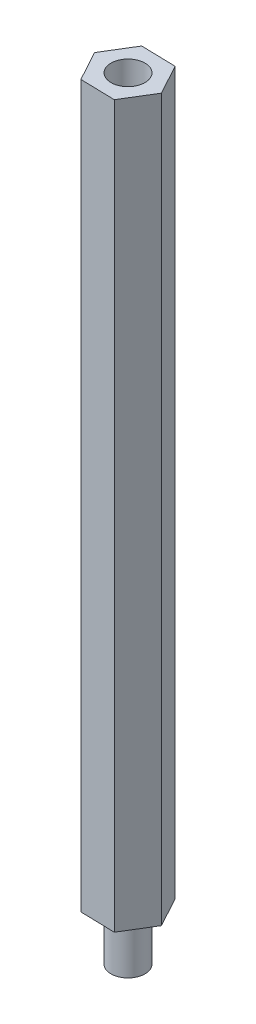
ISO-10303-21;
HEADER;
FILE_DESCRIPTION(('STEP AP214'),'2;1');
FILE_NAME('part.step','',(''),(''),'','','');
FILE_SCHEMA(('AUTOMOTIVE_DESIGN { 1 0 10303 214 1 1 1 1 }'));
ENDSEC;
DATA;
#1=APPLICATION_CONTEXT('core data for automotive mechanical design processes');
#2=APPLICATION_PROTOCOL_DEFINITION('international standard','automotive_design',2000,#1);
#3=PRODUCT_CONTEXT('',#1,'mechanical');
#4=PRODUCT('Part','Part','',(#3));
#5=PRODUCT_RELATED_PRODUCT_CATEGORY('part','',(#4));
#6=PRODUCT_DEFINITION_FORMATION('','',#4);
#7=PRODUCT_DEFINITION_CONTEXT('part definition',#1,'design');
#8=PRODUCT_DEFINITION('design','',#6,#7);
#9=PRODUCT_DEFINITION_SHAPE('','',#8);
#10=(LENGTH_UNIT() NAMED_UNIT(*) SI_UNIT(.MILLI.,.METRE.));
#11=(NAMED_UNIT(*) PLANE_ANGLE_UNIT() SI_UNIT($,.RADIAN.));
#12=(NAMED_UNIT(*) SI_UNIT($,.STERADIAN.) SOLID_ANGLE_UNIT());
#13=UNCERTAINTY_MEASURE_WITH_UNIT(LENGTH_MEASURE(1.E-05),#10,'distance_accuracy_value','');
#14=(GEOMETRIC_REPRESENTATION_CONTEXT(3) GLOBAL_UNCERTAINTY_ASSIGNED_CONTEXT((#13)) GLOBAL_UNIT_ASSIGNED_CONTEXT((#10,
#11,#12)) REPRESENTATION_CONTEXT('',''));
#15=CARTESIAN_POINT('',(0.,0.,0.));
#16=DIRECTION('',(0.,0.,1.));
#17=DIRECTION('',(1.,0.,0.));
#18=AXIS2_PLACEMENT_3D('',#15,#16,#17);
#19=CARTESIAN_POINT('',(-2.10856113065434,85.,3.44779687505327));
#20=DIRECTION('',(0.0252802878709677,0.,-0.999680402451284));
#21=DIRECTION('',(-0.999680402451284,0.,-0.0252802878709678));
#22=AXIS2_PLACEMENT_3D('',#19,#20,#21);
#23=PLANE('',#22);
#24=DIRECTION('',(0.999680402451284,0.,0.0252802878709678));
#25=VECTOR('',#24,1.);
#26=CARTESIAN_POINT('',(-2.10856113065434,0.,3.44779687505327));
#27=LINE('',#26,#25);
#28=CARTESIAN_POINT('',(-2.10856113065434,0.,3.44779687505327));
#29=VERTEX_POINT('',#28);
#30=CARTESIAN_POINT('',(1.93159911555756,0.,3.54996594210573));
#31=VERTEX_POINT('',#30);
#32=EDGE_CURVE('E136',#29,#31,#27,.T.);
#33=ORIENTED_EDGE('',*,*,#32,.T.);
#34=DIRECTION('',(0.,-1.,0.));
#35=VECTOR('',#34,1.);
#36=CARTESIAN_POINT('',(1.93159911555756,85.,3.54996594210573));
#37=LINE('',#36,#35);
#38=CARTESIAN_POINT('',(1.93159911555756,85.,3.54996594210573));
#39=VERTEX_POINT('',#38);
#40=EDGE_CURVE('E48',#39,#31,#37,.T.);
#41=ORIENTED_EDGE('',*,*,#40,.F.);
#42=DIRECTION('',(0.999680402451284,0.,0.0252802878709678));
#43=VECTOR('',#42,1.);
#44=CARTESIAN_POINT('',(-2.10856113065434,85.,3.44779687505327));
#45=LINE('',#44,#43);
#46=CARTESIAN_POINT('',(-2.10856113065434,85.,3.44779687505327));
#47=VERTEX_POINT('',#46);
#48=EDGE_CURVE('E153',#47,#39,#45,.T.);
#49=ORIENTED_EDGE('',*,*,#48,.F.);
#50=DIRECTION('',(0.,-1.,0.));
#51=VECTOR('',#50,1.);
#52=CARTESIAN_POINT('',(-2.10856113065434,85.,3.44779687505327));
#53=LINE('',#52,#51);
#54=EDGE_CURVE('E132',#47,#29,#53,.T.);
#55=ORIENTED_EDGE('',*,*,#54,.T.);
#56=EDGE_LOOP('',(#33,#41,#49,#55));
#57=FACE_BOUND('',#56,.T.);
#58=ADVANCED_FACE('F45',(#57),#23,.F.);
#59=CARTESIAN_POINT('',(1.93159911555756,85.,3.54996594210573));
#60=DIRECTION('',(-0.853108480252779,0.,-0.521733572736884));
#61=DIRECTION('',(-0.521733572736884,0.,0.85310848025278));
#62=AXIS2_PLACEMENT_3D('',#59,#60,#61);
#63=PLANE('',#62);
#64=DIRECTION('',(0.521733572736883,0.,-0.853108480252779));
#65=VECTOR('',#64,1.);
#66=CARTESIAN_POINT('',(1.93159911555756,0.,3.54996594210573));
#67=LINE('',#66,#65);
#68=CARTESIAN_POINT('',(4.0401602462119,0.,0.102169067052459));
#69=VERTEX_POINT('',#68);
#70=EDGE_CURVE('E140',#31,#69,#67,.T.);
#71=ORIENTED_EDGE('',*,*,#70,.T.);
#72=DIRECTION('',(0.,-1.,0.));
#73=VECTOR('',#72,1.);
#74=CARTESIAN_POINT('',(4.0401602462119,85.,0.102169067052459));
#75=LINE('',#74,#73);
#76=CARTESIAN_POINT('',(4.0401602462119,85.,0.102169067052459));
#77=VERTEX_POINT('',#76);
#78=EDGE_CURVE('E159',#77,#69,#75,.T.);
#79=ORIENTED_EDGE('',*,*,#78,.F.);
#80=DIRECTION('',(0.521733572736883,0.,-0.853108480252779));
#81=VECTOR('',#80,1.);
#82=CARTESIAN_POINT('',(1.93159911555756,85.,3.54996594210573));
#83=LINE('',#82,#81);
#84=EDGE_CURVE('E101',#39,#77,#83,.T.);
#85=ORIENTED_EDGE('',*,*,#84,.F.);
#86=ORIENTED_EDGE('',*,*,#40,.T.);
#87=EDGE_LOOP('',(#71,#79,#85,#86));
#88=FACE_BOUND('',#87,.T.);
#89=ADVANCED_FACE('F166',(#88),#63,.F.);
#90=CARTESIAN_POINT('',(4.0401602462119,85.,0.102169067052459));
#91=DIRECTION('',(-0.878388768123747,0.,0.477946829714401));
#92=DIRECTION('',(0.477946829714401,0.,0.878388768123747));
#93=AXIS2_PLACEMENT_3D('',#90,#91,#92);
#94=PLANE('',#93);
#95=DIRECTION('',(-0.4779468297144,0.,-0.878388768123747));
#96=VECTOR('',#95,1.);
#97=CARTESIAN_POINT('',(4.0401602462119,0.,0.102169067052459));
#98=LINE('',#97,#96);
#99=CARTESIAN_POINT('',(2.10856113065434,0.,-3.44779687505327));
#100=VERTEX_POINT('',#99);
#101=EDGE_CURVE('E144',#69,#100,#98,.T.);
#102=ORIENTED_EDGE('',*,*,#101,.T.);
#103=DIRECTION('',(0.,-1.,0.));
#104=VECTOR('',#103,1.);
#105=CARTESIAN_POINT('',(2.10856113065434,85.,-3.44779687505327));
#106=LINE('',#105,#104);
#107=CARTESIAN_POINT('',(2.10856113065434,85.,-3.44779687505327));
#108=VERTEX_POINT('',#107);
#109=EDGE_CURVE('E125',#108,#100,#106,.T.);
#110=ORIENTED_EDGE('',*,*,#109,.F.);
#111=DIRECTION('',(-0.4779468297144,0.,-0.878388768123747));
#112=VECTOR('',#111,1.);
#113=CARTESIAN_POINT('',(4.0401602462119,85.,0.102169067052459));
#114=LINE('',#113,#112);
#115=EDGE_CURVE('E114',#77,#108,#114,.T.);
#116=ORIENTED_EDGE('',*,*,#115,.F.);
#117=ORIENTED_EDGE('',*,*,#78,.T.);
#118=EDGE_LOOP('',(#102,#110,#116,#117));
#119=FACE_BOUND('',#118,.T.);
#120=ADVANCED_FACE('F172',(#119),#94,.F.);
#121=CARTESIAN_POINT('',(2.10856113065434,85.,-3.44779687505327));
#122=DIRECTION('',(-0.0252802878709678,0.,0.999680402451284));
#123=DIRECTION('',(0.999680402451284,0.,0.0252802878709678));
#124=AXIS2_PLACEMENT_3D('',#121,#122,#123);
#125=PLANE('',#124);
#126=DIRECTION('',(-0.999680402451284,0.,-0.0252802878709678));
#127=VECTOR('',#126,1.);
#128=CARTESIAN_POINT('',(2.10856113065434,0.,-3.44779687505327));
#129=LINE('',#128,#127);
#130=CARTESIAN_POINT('',(-1.93159911555756,0.,-3.54996594210573));
#131=VERTEX_POINT('',#130);
#132=EDGE_CURVE('E123',#100,#131,#129,.T.);
#133=ORIENTED_EDGE('',*,*,#132,.T.);
#134=DIRECTION('',(0.,-1.,0.));
#135=VECTOR('',#134,1.);
#136=CARTESIAN_POINT('',(-1.93159911555756,85.,-3.54996594210573));
#137=LINE('',#136,#135);
#138=CARTESIAN_POINT('',(-1.93159911555756,85.,-3.54996594210573));
#139=VERTEX_POINT('',#138);
#140=EDGE_CURVE('E120',#139,#131,#137,.T.);
#141=ORIENTED_EDGE('',*,*,#140,.F.);
#142=DIRECTION('',(-0.999680402451284,0.,-0.0252802878709678));
#143=VECTOR('',#142,1.);
#144=CARTESIAN_POINT('',(2.10856113065434,85.,-3.44779687505327));
#145=LINE('',#144,#143);
#146=EDGE_CURVE('E108',#108,#139,#145,.T.);
#147=ORIENTED_EDGE('',*,*,#146,.F.);
#148=ORIENTED_EDGE('',*,*,#109,.T.);
#149=EDGE_LOOP('',(#133,#141,#147,#148));
#150=FACE_BOUND('',#149,.T.);
#151=ADVANCED_FACE('F121',(#150),#125,.F.);
#152=CARTESIAN_POINT('',(-1.93159911555756,85.,-3.54996594210573));
#153=DIRECTION('',(0.853108480252779,0.,0.521733572736884));
#154=DIRECTION('',(0.521733572736884,0.,-0.853108480252779));
#155=AXIS2_PLACEMENT_3D('',#152,#153,#154);
#156=PLANE('',#155);
#157=DIRECTION('',(-0.521733572736884,0.,0.853108480252779));
#158=VECTOR('',#157,1.);
#159=CARTESIAN_POINT('',(-1.93159911555756,0.,-3.54996594210573));
#160=LINE('',#159,#158);
#161=CARTESIAN_POINT('',(-4.0401602462119,0.,-0.10216906705246));
#162=VERTEX_POINT('',#161);
#163=EDGE_CURVE('E86',#131,#162,#160,.T.);
#164=ORIENTED_EDGE('',*,*,#163,.T.);
#165=DIRECTION('',(0.,-1.,0.));
#166=VECTOR('',#165,1.);
#167=CARTESIAN_POINT('',(-4.0401602462119,85.,-0.10216906705246));
#168=LINE('',#167,#166);
#169=CARTESIAN_POINT('',(-4.0401602462119,85.,-0.10216906705246));
#170=VERTEX_POINT('',#169);
#171=EDGE_CURVE('E126',#170,#162,#168,.T.);
#172=ORIENTED_EDGE('',*,*,#171,.F.);
#173=DIRECTION('',(-0.521733572736884,0.,0.853108480252779));
#174=VECTOR('',#173,1.);
#175=CARTESIAN_POINT('',(-1.93159911555756,85.,-3.54996594210573));
#176=LINE('',#175,#174);
#177=EDGE_CURVE('E112',#139,#170,#176,.T.);
#178=ORIENTED_EDGE('',*,*,#177,.F.);
#179=ORIENTED_EDGE('',*,*,#140,.T.);
#180=EDGE_LOOP('',(#164,#172,#178,#179));
#181=FACE_BOUND('',#180,.T.);
#182=ADVANCED_FACE('F128',(#181),#156,.F.);
#183=CARTESIAN_POINT('',(-4.0401602462119,85.,-0.10216906705246));
#184=DIRECTION('',(0.878388768123747,0.,-0.477946829714401));
#185=DIRECTION('',(-0.477946829714401,0.,-0.878388768123747));
#186=AXIS2_PLACEMENT_3D('',#183,#184,#185);
#187=PLANE('',#186);
#188=DIRECTION('',(0.4779468297144,0.,0.878388768123747));
#189=VECTOR('',#188,1.);
#190=CARTESIAN_POINT('',(-4.0401602462119,0.,-0.10216906705246));
#191=LINE('',#190,#189);
#192=EDGE_CURVE('E92',#162,#29,#191,.T.);
#193=ORIENTED_EDGE('',*,*,#192,.T.);
#194=ORIENTED_EDGE('',*,*,#54,.F.);
#195=DIRECTION('',(0.4779468297144,0.,0.878388768123747));
#196=VECTOR('',#195,1.);
#197=CARTESIAN_POINT('',(-4.0401602462119,85.,-0.10216906705246));
#198=LINE('',#197,#196);
#199=EDGE_CURVE('E63',#170,#47,#198,.T.);
#200=ORIENTED_EDGE('',*,*,#199,.F.);
#201=ORIENTED_EDGE('',*,*,#171,.T.);
#202=EDGE_LOOP('',(#193,#194,#200,#201));
#203=FACE_BOUND('',#202,.T.);
#204=ADVANCED_FACE('F210',(#203),#187,.F.);
#205=CARTESIAN_POINT('',(0.,85.,0.));
#206=DIRECTION('',(0.,1.,0.));
#207=DIRECTION('',(0.,0.,1.));
#208=AXIS2_PLACEMENT_3D('',#205,#206,#207);
#209=PLANE('',#208);
#210=CARTESIAN_POINT('',(0.,85.,0.));
#211=DIRECTION('',(0.,1.,0.));
#212=DIRECTION('',(0.,0.,1.));
#213=AXIS2_PLACEMENT_3D('',#210,#211,#212);
#214=CIRCLE('',#213,2.);
#215=CARTESIAN_POINT('',(0.,85.,2.));
#216=VERTEX_POINT('',#215);
#217=EDGE_CURVE('E179',#216,#216,#214,.T.);
#218=ORIENTED_EDGE('',*,*,#217,.F.);
#219=EDGE_LOOP('',(#218));
#220=FACE_BOUND('',#219,.T.);
#221=ORIENTED_EDGE('',*,*,#48,.T.);
#222=ORIENTED_EDGE('',*,*,#84,.T.);
#223=ORIENTED_EDGE('',*,*,#115,.T.);
#224=ORIENTED_EDGE('',*,*,#146,.T.);
#225=ORIENTED_EDGE('',*,*,#177,.T.);
#226=ORIENTED_EDGE('',*,*,#199,.T.);
#227=EDGE_LOOP('',(#221,#222,#223,#224,#225,#226));
#228=FACE_BOUND('',#227,.T.);
#229=ADVANCED_FACE('F110',(#220,#228),#209,.T.);
#230=CARTESIAN_POINT('',(0.,0.,0.));
#231=DIRECTION('',(0.,1.,0.));
#232=DIRECTION('',(0.,0.,1.));
#233=AXIS2_PLACEMENT_3D('',#230,#231,#232);
#234=PLANE('',#233);
#235=CARTESIAN_POINT('',(0.,0.,0.));
#236=DIRECTION('',(0.,-1.,0.));
#237=DIRECTION('',(0.,0.,-1.));
#238=AXIS2_PLACEMENT_3D('',#235,#236,#237);
#239=CIRCLE('',#238,2.);
#240=CARTESIAN_POINT('',(0.,0.,-2.));
#241=VERTEX_POINT('',#240);
#242=EDGE_CURVE('E11',#241,#241,#239,.T.);
#243=ORIENTED_EDGE('',*,*,#242,.F.);
#244=EDGE_LOOP('',(#243));
#245=FACE_BOUND('',#244,.T.);
#246=ORIENTED_EDGE('',*,*,#32,.F.);
#247=ORIENTED_EDGE('',*,*,#192,.F.);
#248=ORIENTED_EDGE('',*,*,#163,.F.);
#249=ORIENTED_EDGE('',*,*,#132,.F.);
#250=ORIENTED_EDGE('',*,*,#101,.F.);
#251=ORIENTED_EDGE('',*,*,#70,.F.);
#252=EDGE_LOOP('',(#246,#247,#248,#249,#250,#251));
#253=FACE_BOUND('',#252,.T.);
#254=ADVANCED_FACE('F171',(#245,#253),#234,.F.);
#255=CARTESIAN_POINT('',(0.,77.,0.));
#256=DIRECTION('',(0.,1.,0.));
#257=DIRECTION('',(0.,0.,1.));
#258=AXIS2_PLACEMENT_3D('',#255,#256,#257);
#259=CYLINDRICAL_SURFACE('',#258,2.);
#260=CARTESIAN_POINT('',(0.,77.,0.));
#261=DIRECTION('',(0.,1.,0.));
#262=DIRECTION('',(0.,0.,1.));
#263=AXIS2_PLACEMENT_3D('',#260,#261,#262);
#264=CIRCLE('',#263,2.);
#265=CARTESIAN_POINT('',(0.,77.,2.));
#266=VERTEX_POINT('',#265);
#267=EDGE_CURVE('E141',#266,#266,#264,.T.);
#268=ORIENTED_EDGE('',*,*,#267,.F.);
#269=EDGE_LOOP('',(#268));
#270=FACE_BOUND('',#269,.T.);
#271=ORIENTED_EDGE('',*,*,#217,.T.);
#272=EDGE_LOOP('',(#271));
#273=FACE_BOUND('',#272,.T.);
#274=ADVANCED_FACE('F201',(#270,#273),#259,.F.);
#275=CARTESIAN_POINT('',(0.,77.,0.));
#276=DIRECTION('',(0.,1.,0.));
#277=DIRECTION('',(0.,0.,1.));
#278=AXIS2_PLACEMENT_3D('',#275,#276,#277);
#279=PLANE('',#278);
#280=ORIENTED_EDGE('',*,*,#267,.T.);
#281=EDGE_LOOP('',(#280));
#282=FACE_BOUND('',#281,.T.);
#283=ADVANCED_FACE('F196',(#282),#279,.T.);
#284=CARTESIAN_POINT('',(0.,-6.,0.));
#285=DIRECTION('',(0.,1.,0.));
#286=DIRECTION('',(0.,0.,1.));
#287=AXIS2_PLACEMENT_3D('',#284,#285,#286);
#288=CYLINDRICAL_SURFACE('',#287,2.);
#289=CARTESIAN_POINT('',(0.,-6.,0.));
#290=DIRECTION('',(0.,-1.,0.));
#291=DIRECTION('',(0.,0.,-1.));
#292=AXIS2_PLACEMENT_3D('',#289,#290,#291);
#293=CIRCLE('',#292,2.);
#294=CARTESIAN_POINT('',(0.,-6.,-2.));
#295=VERTEX_POINT('',#294);
#296=EDGE_CURVE('E183',#295,#295,#293,.T.);
#297=ORIENTED_EDGE('',*,*,#296,.F.);
#298=EDGE_LOOP('',(#297));
#299=FACE_BOUND('',#298,.T.);
#300=ORIENTED_EDGE('',*,*,#242,.T.);
#301=EDGE_LOOP('',(#300));
#302=FACE_BOUND('',#301,.T.);
#303=ADVANCED_FACE('F193',(#299,#302),#288,.T.);
#304=CARTESIAN_POINT('',(0.,-6.,0.));
#305=DIRECTION('',(0.,-1.,0.));
#306=DIRECTION('',(0.,0.,-1.));
#307=AXIS2_PLACEMENT_3D('',#304,#305,#306);
#308=PLANE('',#307);
#309=ORIENTED_EDGE('',*,*,#296,.T.);
#310=EDGE_LOOP('',(#309));
#311=FACE_BOUND('',#310,.T.);
#312=ADVANCED_FACE('F191',(#311),#308,.T.);
#313=CLOSED_SHELL('',(#58,#89,#120,#151,#182,#204,#229,#254,#274,#283,#303,#312));
#314=MANIFOLD_SOLID_BREP('B2',#313);
#315=ADVANCED_BREP_SHAPE_REPRESENTATION('',(#18,#314),#14);
#316=SHAPE_DEFINITION_REPRESENTATION(#9,#315);
ENDSEC;
END-ISO-10303-21;
